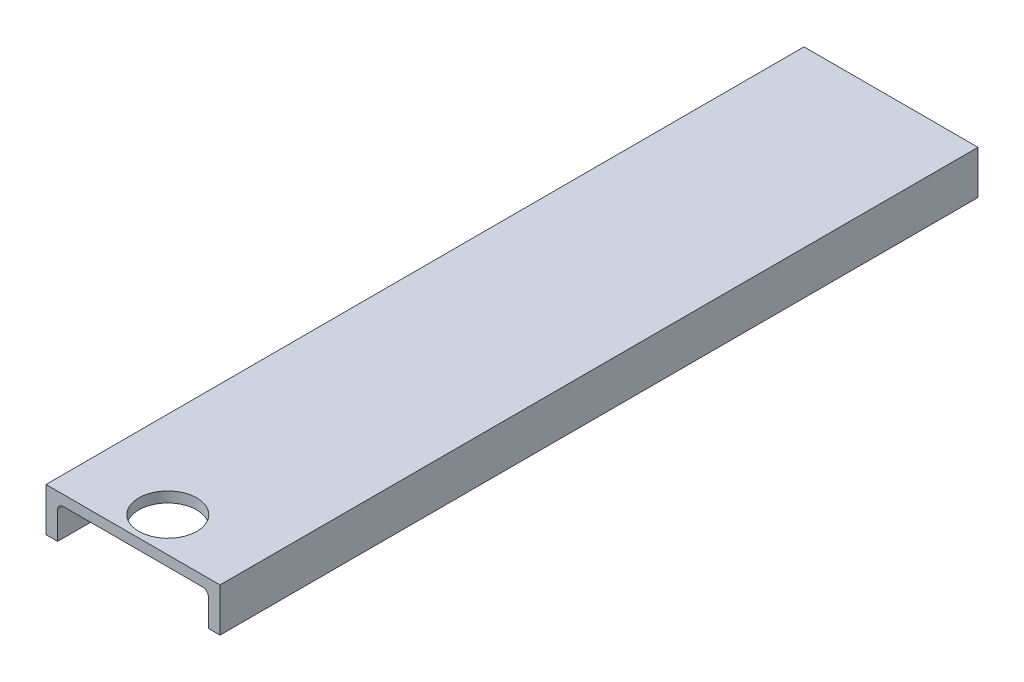
ISO-10303-21;
HEADER;
FILE_DESCRIPTION(('STEP AP214'),'2;1');
FILE_NAME('part.step','',(''),(''),'','','');
FILE_SCHEMA(('AUTOMOTIVE_DESIGN { 1 0 10303 214 1 1 1 1 }'));
ENDSEC;
DATA;
#1=APPLICATION_CONTEXT('core data for automotive mechanical design processes');
#2=APPLICATION_PROTOCOL_DEFINITION('international standard','automotive_design',2000,#1);
#3=PRODUCT_CONTEXT('',#1,'mechanical');
#4=PRODUCT('Part','Part','',(#3));
#5=PRODUCT_RELATED_PRODUCT_CATEGORY('part','',(#4));
#6=PRODUCT_DEFINITION_FORMATION('','',#4);
#7=PRODUCT_DEFINITION_CONTEXT('part definition',#1,'design');
#8=PRODUCT_DEFINITION('design','',#6,#7);
#9=PRODUCT_DEFINITION_SHAPE('','',#8);
#10=(LENGTH_UNIT() NAMED_UNIT(*) SI_UNIT(.MILLI.,.METRE.));
#11=(NAMED_UNIT(*) PLANE_ANGLE_UNIT() SI_UNIT($,.RADIAN.));
#12=(NAMED_UNIT(*) SI_UNIT($,.STERADIAN.) SOLID_ANGLE_UNIT());
#13=UNCERTAINTY_MEASURE_WITH_UNIT(LENGTH_MEASURE(1.E-05),#10,'distance_accuracy_value','');
#14=(GEOMETRIC_REPRESENTATION_CONTEXT(3) GLOBAL_UNCERTAINTY_ASSIGNED_CONTEXT((#13)) GLOBAL_UNIT_ASSIGNED_CONTEXT((#10,
#11,#12)) REPRESENTATION_CONTEXT('',''));
#15=CARTESIAN_POINT('',(0.,0.,0.));
#16=DIRECTION('',(0.,0.,1.));
#17=DIRECTION('',(1.,0.,0.));
#18=AXIS2_PLACEMENT_3D('',#15,#16,#17);
#19=CARTESIAN_POINT('',(-38.1,0.,331.978));
#20=DIRECTION('',(1.,0.,0.));
#21=DIRECTION('',(0.,0.,-1.));
#22=AXIS2_PLACEMENT_3D('',#19,#20,#21);
#23=PLANE('',#22);
#24=DIRECTION('',(0.,-1.,0.));
#25=VECTOR('',#24,1.);
#26=CARTESIAN_POINT('',(-38.1,0.,0.));
#27=LINE('',#26,#25);
#28=CARTESIAN_POINT('',(-38.1,0.,0.));
#29=VERTEX_POINT('',#28);
#30=CARTESIAN_POINT('',(-38.1,-19.05,0.));
#31=VERTEX_POINT('',#30);
#32=EDGE_CURVE('E193',#29,#31,#27,.T.);
#33=ORIENTED_EDGE('',*,*,#32,.T.);
#34=DIRECTION('',(0.,0.,-1.));
#35=VECTOR('',#34,1.);
#36=CARTESIAN_POINT('',(-38.1,-19.05,331.978));
#37=LINE('',#36,#35);
#38=CARTESIAN_POINT('',(-38.1,-19.05,331.978));
#39=VERTEX_POINT('',#38);
#40=EDGE_CURVE('E115',#39,#31,#37,.T.);
#41=ORIENTED_EDGE('',*,*,#40,.F.);
#42=DIRECTION('',(0.,-1.,0.));
#43=VECTOR('',#42,1.);
#44=CARTESIAN_POINT('',(-38.1,0.,331.978));
#45=LINE('',#44,#43);
#46=CARTESIAN_POINT('',(-38.1,0.,331.978));
#47=VERTEX_POINT('',#46);
#48=EDGE_CURVE('E110',#47,#39,#45,.T.);
#49=ORIENTED_EDGE('',*,*,#48,.F.);
#50=DIRECTION('',(0.,0.,-1.));
#51=VECTOR('',#50,1.);
#52=CARTESIAN_POINT('',(-38.1,0.,331.978));
#53=LINE('',#52,#51);
#54=EDGE_CURVE('E113',#47,#29,#53,.T.);
#55=ORIENTED_EDGE('',*,*,#54,.T.);
#56=EDGE_LOOP('',(#33,#41,#49,#55));
#57=FACE_BOUND('',#56,.T.);
#58=ADVANCED_FACE('F33',(#57),#23,.F.);
#59=CARTESIAN_POINT('',(-38.1,-19.05,331.978));
#60=DIRECTION('',(0.,1.,0.));
#61=DIRECTION('',(0.,0.,1.));
#62=AXIS2_PLACEMENT_3D('',#59,#60,#61);
#63=PLANE('',#62);
#64=DIRECTION('',(1.,0.,0.));
#65=VECTOR('',#64,1.);
#66=CARTESIAN_POINT('',(-38.1,-19.05,0.));
#67=LINE('',#66,#65);
#68=CARTESIAN_POINT('',(-33.02,-19.05,0.));
#69=VERTEX_POINT('',#68);
#70=EDGE_CURVE('E192',#31,#69,#67,.T.);
#71=ORIENTED_EDGE('',*,*,#70,.T.);
#72=DIRECTION('',(0.,0.,-1.));
#73=VECTOR('',#72,1.);
#74=CARTESIAN_POINT('',(-33.02,-19.05,331.978));
#75=LINE('',#74,#73);
#76=CARTESIAN_POINT('',(-33.02,-19.05,331.978));
#77=VERTEX_POINT('',#76);
#78=EDGE_CURVE('E138',#77,#69,#75,.T.);
#79=ORIENTED_EDGE('',*,*,#78,.F.);
#80=DIRECTION('',(1.,0.,0.));
#81=VECTOR('',#80,1.);
#82=CARTESIAN_POINT('',(-38.1,-19.05,331.978));
#83=LINE('',#82,#81);
#84=EDGE_CURVE('E118',#39,#77,#83,.T.);
#85=ORIENTED_EDGE('',*,*,#84,.F.);
#86=ORIENTED_EDGE('',*,*,#40,.T.);
#87=EDGE_LOOP('',(#71,#79,#85,#86));
#88=FACE_BOUND('',#87,.T.);
#89=ADVANCED_FACE('F228',(#88),#63,.F.);
#90=CARTESIAN_POINT('',(-33.02,-19.05,331.978));
#91=DIRECTION('',(-1.,0.,0.));
#92=DIRECTION('',(0.,0.,1.));
#93=AXIS2_PLACEMENT_3D('',#90,#91,#92);
#94=PLANE('',#93);
#95=DIRECTION('',(0.,1.,0.));
#96=VECTOR('',#95,1.);
#97=CARTESIAN_POINT('',(-33.02,-19.05,0.));
#98=LINE('',#97,#96);
#99=CARTESIAN_POINT('',(-33.02,-7.11200000000001,0.));
#100=VERTEX_POINT('',#99);
#101=EDGE_CURVE('E168',#69,#100,#98,.T.);
#102=ORIENTED_EDGE('',*,*,#101,.T.);
#103=DIRECTION('',(0.,0.,-1.));
#104=VECTOR('',#103,1.);
#105=CARTESIAN_POINT('',(-33.02,-7.11200000000001,331.978));
#106=LINE('',#105,#104);
#107=CARTESIAN_POINT('',(-33.02,-7.11200000000001,331.978));
#108=VERTEX_POINT('',#107);
#109=EDGE_CURVE('E136',#100,#108,#106,.F.);
#110=ORIENTED_EDGE('',*,*,#109,.T.);
#111=DIRECTION('',(0.,1.,0.));
#112=VECTOR('',#111,1.);
#113=CARTESIAN_POINT('',(-33.02,-19.05,331.978));
#114=LINE('',#113,#112);
#115=EDGE_CURVE('E189',#77,#108,#114,.T.);
#116=ORIENTED_EDGE('',*,*,#115,.F.);
#117=ORIENTED_EDGE('',*,*,#78,.T.);
#118=EDGE_LOOP('',(#102,#110,#116,#117));
#119=FACE_BOUND('',#118,.T.);
#120=ADVANCED_FACE('F186',(#119),#94,.F.);
#121=CARTESIAN_POINT('',(33.02,-4.572,331.978));
#122=DIRECTION('',(0.,1.,0.));
#123=DIRECTION('',(-1.,0.,0.));
#124=AXIS2_PLACEMENT_3D('',#121,#122,#123);
#125=PLANE('',#124);
#126=CARTESIAN_POINT('',(0.,-4.57200000000001,316.738));
#127=DIRECTION('',(0.,1.,0.));
#128=DIRECTION('',(-1.,0.,0.));
#129=AXIS2_PLACEMENT_3D('',#126,#127,#128);
#130=CIRCLE('',#129,12.7);
#131=CARTESIAN_POINT('',(0.,-4.57200000000001,329.438));
#132=VERTEX_POINT('',#131);
#133=EDGE_CURVE('E197',#132,#132,#130,.T.);
#134=ORIENTED_EDGE('',*,*,#133,.T.);
#135=EDGE_LOOP('',(#134));
#136=FACE_BOUND('',#135,.T.);
#137=DIRECTION('',(1.,0.,0.));
#138=VECTOR('',#137,1.);
#139=CARTESIAN_POINT('',(33.02,-4.572,0.));
#140=LINE('',#139,#138);
#141=CARTESIAN_POINT('',(-30.48,-4.57200000000001,0.));
#142=VERTEX_POINT('',#141);
#143=CARTESIAN_POINT('',(30.48,-4.572,0.));
#144=VERTEX_POINT('',#143);
#145=EDGE_CURVE('E164',#142,#144,#140,.T.);
#146=ORIENTED_EDGE('',*,*,#145,.T.);
#147=DIRECTION('',(0.,0.,-1.));
#148=VECTOR('',#147,1.);
#149=CARTESIAN_POINT('',(30.48,-4.572,331.978));
#150=LINE('',#149,#148);
#151=CARTESIAN_POINT('',(30.48,-4.572,331.978));
#152=VERTEX_POINT('',#151);
#153=EDGE_CURVE('E54',#144,#152,#150,.F.);
#154=ORIENTED_EDGE('',*,*,#153,.T.);
#155=DIRECTION('',(1.,0.,0.));
#156=VECTOR('',#155,1.);
#157=CARTESIAN_POINT('',(33.02,-4.572,331.978));
#158=LINE('',#157,#156);
#159=CARTESIAN_POINT('',(-30.48,-4.57200000000001,331.978));
#160=VERTEX_POINT('',#159);
#161=EDGE_CURVE('E202',#160,#152,#158,.T.);
#162=ORIENTED_EDGE('',*,*,#161,.F.);
#163=DIRECTION('',(0.,0.,-1.));
#164=VECTOR('',#163,1.);
#165=CARTESIAN_POINT('',(-30.48,-4.57200000000001,0.));
#166=LINE('',#165,#164);
#167=EDGE_CURVE('E133',#160,#142,#166,.T.);
#168=ORIENTED_EDGE('',*,*,#167,.T.);
#169=EDGE_LOOP('',(#146,#154,#162,#168));
#170=FACE_BOUND('',#169,.T.);
#171=ADVANCED_FACE('F244',(#136,#170),#125,.F.);
#172=CARTESIAN_POINT('',(33.02,-19.05,331.978));
#173=DIRECTION('',(1.,0.,0.));
#174=DIRECTION('',(0.,0.,-1.));
#175=AXIS2_PLACEMENT_3D('',#172,#173,#174);
#176=PLANE('',#175);
#177=DIRECTION('',(0.,-1.,0.));
#178=VECTOR('',#177,1.);
#179=CARTESIAN_POINT('',(33.02,-19.05,331.978));
#180=LINE('',#179,#178);
#181=CARTESIAN_POINT('',(33.02,-7.112,331.978));
#182=VERTEX_POINT('',#181);
#183=CARTESIAN_POINT('',(33.02,-19.05,331.978));
#184=VERTEX_POINT('',#183);
#185=EDGE_CURVE('E157',#182,#184,#180,.T.);
#186=ORIENTED_EDGE('',*,*,#185,.F.);
#187=DIRECTION('',(0.,0.,-1.));
#188=VECTOR('',#187,1.);
#189=CARTESIAN_POINT('',(33.02,-7.112,0.));
#190=LINE('',#189,#188);
#191=CARTESIAN_POINT('',(33.02,-7.112,0.));
#192=VERTEX_POINT('',#191);
#193=EDGE_CURVE('E147',#182,#192,#190,.T.);
#194=ORIENTED_EDGE('',*,*,#193,.T.);
#195=DIRECTION('',(0.,-1.,0.));
#196=VECTOR('',#195,1.);
#197=CARTESIAN_POINT('',(33.02,-19.05,0.));
#198=LINE('',#197,#196);
#199=CARTESIAN_POINT('',(33.02,-19.05,0.));
#200=VERTEX_POINT('',#199);
#201=EDGE_CURVE('E155',#192,#200,#198,.T.);
#202=ORIENTED_EDGE('',*,*,#201,.T.);
#203=DIRECTION('',(0.,0.,-1.));
#204=VECTOR('',#203,1.);
#205=CARTESIAN_POINT('',(33.02,-19.05,331.978));
#206=LINE('',#205,#204);
#207=EDGE_CURVE('E179',#184,#200,#206,.T.);
#208=ORIENTED_EDGE('',*,*,#207,.F.);
#209=EDGE_LOOP('',(#186,#194,#202,#208));
#210=FACE_BOUND('',#209,.T.);
#211=ADVANCED_FACE('F153',(#210),#176,.F.);
#212=CARTESIAN_POINT('',(38.1,-19.05,331.978));
#213=DIRECTION('',(0.,1.,0.));
#214=DIRECTION('',(0.,0.,1.));
#215=AXIS2_PLACEMENT_3D('',#212,#213,#214);
#216=PLANE('',#215);
#217=DIRECTION('',(1.,0.,0.));
#218=VECTOR('',#217,1.);
#219=CARTESIAN_POINT('',(38.1,-19.05,0.));
#220=LINE('',#219,#218);
#221=CARTESIAN_POINT('',(38.1,-19.05,0.));
#222=VERTEX_POINT('',#221);
#223=EDGE_CURVE('E163',#200,#222,#220,.T.);
#224=ORIENTED_EDGE('',*,*,#223,.T.);
#225=DIRECTION('',(0.,0.,-1.));
#226=VECTOR('',#225,1.);
#227=CARTESIAN_POINT('',(38.1,-19.05,331.978));
#228=LINE('',#227,#226);
#229=CARTESIAN_POINT('',(38.1,-19.05,331.978));
#230=VERTEX_POINT('',#229);
#231=EDGE_CURVE('E176',#230,#222,#228,.T.);
#232=ORIENTED_EDGE('',*,*,#231,.F.);
#233=DIRECTION('',(1.,0.,0.));
#234=VECTOR('',#233,1.);
#235=CARTESIAN_POINT('',(38.1,-19.05,331.978));
#236=LINE('',#235,#234);
#237=EDGE_CURVE('E199',#184,#230,#236,.T.);
#238=ORIENTED_EDGE('',*,*,#237,.F.);
#239=ORIENTED_EDGE('',*,*,#207,.T.);
#240=EDGE_LOOP('',(#224,#232,#238,#239));
#241=FACE_BOUND('',#240,.T.);
#242=ADVANCED_FACE('F223',(#241),#216,.F.);
#243=CARTESIAN_POINT('',(38.1,0.,331.978));
#244=DIRECTION('',(-1.,0.,0.));
#245=DIRECTION('',(0.,0.,1.));
#246=AXIS2_PLACEMENT_3D('',#243,#244,#245);
#247=PLANE('',#246);
#248=DIRECTION('',(0.,1.,0.));
#249=VECTOR('',#248,1.);
#250=CARTESIAN_POINT('',(38.1,0.,0.));
#251=LINE('',#250,#249);
#252=CARTESIAN_POINT('',(38.1,0.,0.));
#253=VERTEX_POINT('',#252);
#254=EDGE_CURVE('E166',#222,#253,#251,.T.);
#255=ORIENTED_EDGE('',*,*,#254,.T.);
#256=DIRECTION('',(0.,0.,-1.));
#257=VECTOR('',#256,1.);
#258=CARTESIAN_POINT('',(38.1,0.,331.978));
#259=LINE('',#258,#257);
#260=CARTESIAN_POINT('',(38.1,0.,331.978));
#261=VERTEX_POINT('',#260);
#262=EDGE_CURVE('E174',#261,#253,#259,.T.);
#263=ORIENTED_EDGE('',*,*,#262,.F.);
#264=DIRECTION('',(0.,1.,0.));
#265=VECTOR('',#264,1.);
#266=CARTESIAN_POINT('',(38.1,0.,331.978));
#267=LINE('',#266,#265);
#268=EDGE_CURVE('E124',#230,#261,#267,.T.);
#269=ORIENTED_EDGE('',*,*,#268,.F.);
#270=ORIENTED_EDGE('',*,*,#231,.T.);
#271=EDGE_LOOP('',(#255,#263,#269,#270));
#272=FACE_BOUND('',#271,.T.);
#273=ADVANCED_FACE('F216',(#272),#247,.F.);
#274=CARTESIAN_POINT('',(0.,0.,331.978));
#275=DIRECTION('',(0.,-1.,0.));
#276=DIRECTION('',(0.,0.,-1.));
#277=AXIS2_PLACEMENT_3D('',#274,#275,#276);
#278=PLANE('',#277);
#279=CARTESIAN_POINT('',(0.,0.,316.738));
#280=DIRECTION('',(0.,1.,0.));
#281=DIRECTION('',(0.,0.,1.));
#282=AXIS2_PLACEMENT_3D('',#279,#280,#281);
#283=CIRCLE('',#282,12.7);
#284=CARTESIAN_POINT('',(0.,0.,329.438));
#285=VERTEX_POINT('',#284);
#286=EDGE_CURVE('E208',#285,#285,#283,.T.);
#287=ORIENTED_EDGE('',*,*,#286,.F.);
#288=EDGE_LOOP('',(#287));
#289=FACE_BOUND('',#288,.T.);
#290=DIRECTION('',(-1.,0.,0.));
#291=VECTOR('',#290,1.);
#292=CARTESIAN_POINT('',(0.,0.,0.));
#293=LINE('',#292,#291);
#294=EDGE_CURVE('E128',#253,#29,#293,.T.);
#295=ORIENTED_EDGE('',*,*,#294,.T.);
#296=ORIENTED_EDGE('',*,*,#54,.F.);
#297=DIRECTION('',(-1.,0.,0.));
#298=VECTOR('',#297,1.);
#299=CARTESIAN_POINT('',(0.,0.,331.978));
#300=LINE('',#299,#298);
#301=EDGE_CURVE('E119',#261,#47,#300,.T.);
#302=ORIENTED_EDGE('',*,*,#301,.F.);
#303=ORIENTED_EDGE('',*,*,#262,.T.);
#304=EDGE_LOOP('',(#295,#296,#302,#303));
#305=FACE_BOUND('',#304,.T.);
#306=ADVANCED_FACE('F130',(#289,#305),#278,.F.);
#307=CARTESIAN_POINT('',(0.,0.,331.978));
#308=DIRECTION('',(0.,0.,1.));
#309=DIRECTION('',(1.,0.,0.));
#310=AXIS2_PLACEMENT_3D('',#307,#308,#309);
#311=PLANE('',#310);
#312=ORIENTED_EDGE('',*,*,#301,.T.);
#313=ORIENTED_EDGE('',*,*,#48,.T.);
#314=ORIENTED_EDGE('',*,*,#84,.T.);
#315=ORIENTED_EDGE('',*,*,#115,.T.);
#316=CARTESIAN_POINT('',(-30.48,-7.11200000000001,331.978));
#317=DIRECTION('',(0.,0.,1.));
#318=DIRECTION('',(1.,0.,0.));
#319=AXIS2_PLACEMENT_3D('',#316,#317,#318);
#320=CIRCLE('',#319,2.54);
#321=EDGE_CURVE('E145',#108,#160,#320,.F.);
#322=ORIENTED_EDGE('',*,*,#321,.T.);
#323=ORIENTED_EDGE('',*,*,#161,.T.);
#324=CARTESIAN_POINT('',(30.48,-7.112,331.978));
#325=DIRECTION('',(0.,0.,1.));
#326=DIRECTION('',(1.,0.,0.));
#327=AXIS2_PLACEMENT_3D('',#324,#325,#326);
#328=CIRCLE('',#327,2.54);
#329=EDGE_CURVE('E11',#152,#182,#328,.F.);
#330=ORIENTED_EDGE('',*,*,#329,.T.);
#331=ORIENTED_EDGE('',*,*,#185,.T.);
#332=ORIENTED_EDGE('',*,*,#237,.T.);
#333=ORIENTED_EDGE('',*,*,#268,.T.);
#334=EDGE_LOOP('',(#312,#313,#314,#315,#322,#323,#330,#331,#332,#333));
#335=FACE_BOUND('',#334,.T.);
#336=ADVANCED_FACE('F122',(#335),#311,.T.);
#337=CARTESIAN_POINT('',(0.,0.,0.));
#338=DIRECTION('',(0.,0.,1.));
#339=DIRECTION('',(1.,0.,0.));
#340=AXIS2_PLACEMENT_3D('',#337,#338,#339);
#341=PLANE('',#340);
#342=ORIENTED_EDGE('',*,*,#32,.F.);
#343=ORIENTED_EDGE('',*,*,#294,.F.);
#344=ORIENTED_EDGE('',*,*,#254,.F.);
#345=ORIENTED_EDGE('',*,*,#223,.F.);
#346=ORIENTED_EDGE('',*,*,#201,.F.);
#347=CARTESIAN_POINT('',(30.48,-7.112,0.));
#348=DIRECTION('',(0.,0.,1.));
#349=DIRECTION('',(1.,0.,0.));
#350=AXIS2_PLACEMENT_3D('',#347,#348,#349);
#351=CIRCLE('',#350,2.54);
#352=EDGE_CURVE('E41',#192,#144,#351,.T.);
#353=ORIENTED_EDGE('',*,*,#352,.T.);
#354=ORIENTED_EDGE('',*,*,#145,.F.);
#355=CARTESIAN_POINT('',(-30.48,-7.11200000000001,0.));
#356=DIRECTION('',(0.,0.,1.));
#357=DIRECTION('',(1.,0.,0.));
#358=AXIS2_PLACEMENT_3D('',#355,#356,#357);
#359=CIRCLE('',#358,2.54);
#360=EDGE_CURVE('E143',#142,#100,#359,.T.);
#361=ORIENTED_EDGE('',*,*,#360,.T.);
#362=ORIENTED_EDGE('',*,*,#101,.F.);
#363=ORIENTED_EDGE('',*,*,#70,.F.);
#364=EDGE_LOOP('',(#342,#343,#344,#345,#346,#353,#354,#361,#362,#363));
#365=FACE_BOUND('',#364,.T.);
#366=ADVANCED_FACE('F161',(#365),#341,.F.);
#367=CARTESIAN_POINT('',(-30.48,-7.11200000000001,331.978));
#368=DIRECTION('',(0.,0.,1.));
#369=DIRECTION('',(1.,0.,0.));
#370=AXIS2_PLACEMENT_3D('',#367,#368,#369);
#371=CYLINDRICAL_SURFACE('',#370,2.54);
#372=ORIENTED_EDGE('',*,*,#321,.F.);
#373=ORIENTED_EDGE('',*,*,#109,.F.);
#374=ORIENTED_EDGE('',*,*,#360,.F.);
#375=ORIENTED_EDGE('',*,*,#167,.F.);
#376=EDGE_LOOP('',(#372,#373,#374,#375));
#377=FACE_BOUND('',#376,.T.);
#378=ADVANCED_FACE('F235',(#377),#371,.F.);
#379=CARTESIAN_POINT('',(30.48,-7.112,331.978));
#380=DIRECTION('',(0.,0.,1.));
#381=DIRECTION('',(1.,0.,0.));
#382=AXIS2_PLACEMENT_3D('',#379,#380,#381);
#383=CYLINDRICAL_SURFACE('',#382,2.54);
#384=ORIENTED_EDGE('',*,*,#329,.F.);
#385=ORIENTED_EDGE('',*,*,#153,.F.);
#386=ORIENTED_EDGE('',*,*,#352,.F.);
#387=ORIENTED_EDGE('',*,*,#193,.F.);
#388=EDGE_LOOP('',(#384,#385,#386,#387));
#389=FACE_BOUND('',#388,.T.);
#390=ADVANCED_FACE('F35',(#389),#383,.F.);
#391=CARTESIAN_POINT('',(0.,-19.05,316.738));
#392=DIRECTION('',(0.,1.,0.));
#393=DIRECTION('',(0.,0.,1.));
#394=AXIS2_PLACEMENT_3D('',#391,#392,#393);
#395=CYLINDRICAL_SURFACE('',#394,12.7);
#396=CARTESIAN_POINT('',(0.,0.,329.438));
#397=CARTESIAN_POINT('',(0.,-0.0476250000000003,329.438));
#398=CARTESIAN_POINT('',(0.,-0.0952500000000004,329.438));
#399=CARTESIAN_POINT('',(0.,-0.190500000000001,329.438));
#400=CARTESIAN_POINT('',(0.,-0.238125000000001,329.438));
#401=CARTESIAN_POINT('',(0.,-0.333375000000001,329.438));
#402=CARTESIAN_POINT('',(0.,-0.381000000000002,329.438));
#403=CARTESIAN_POINT('',(0.,-0.476250000000002,329.438));
#404=CARTESIAN_POINT('',(0.,-0.523875000000002,329.438));
#405=CARTESIAN_POINT('',(0.,-0.619125000000003,329.438));
#406=CARTESIAN_POINT('',(0.,-0.666750000000003,329.438));
#407=CARTESIAN_POINT('',(0.,-0.762000000000002,329.438));
#408=CARTESIAN_POINT('',(0.,-0.809625000000001,329.438));
#409=CARTESIAN_POINT('',(0.,-0.904875000000001,329.438));
#410=CARTESIAN_POINT('',(0.,-0.952500000000001,329.438));
#411=CARTESIAN_POINT('',(0.,-1.04775,329.438));
#412=CARTESIAN_POINT('',(0.,-1.095375,329.438));
#413=CARTESIAN_POINT('',(0.,-1.190625,329.438));
#414=CARTESIAN_POINT('',(0.,-1.23825,329.438));
#415=CARTESIAN_POINT('',(0.,-1.3335,329.438));
#416=CARTESIAN_POINT('',(0.,-1.381125,329.438));
#417=CARTESIAN_POINT('',(0.,-1.476375,329.438));
#418=CARTESIAN_POINT('',(0.,-1.524,329.438));
#419=CARTESIAN_POINT('',(0.,-1.61925,329.438));
#420=CARTESIAN_POINT('',(0.,-1.666875,329.438));
#421=CARTESIAN_POINT('',(0.,-1.762125,329.438));
#422=CARTESIAN_POINT('',(0.,-1.80975,329.438));
#423=CARTESIAN_POINT('',(0.,-1.905,329.438));
#424=CARTESIAN_POINT('',(0.,-1.95262500000001,329.438));
#425=CARTESIAN_POINT('',(0.,-2.04787500000001,329.438));
#426=CARTESIAN_POINT('',(0.,-2.09550000000001,329.438));
#427=CARTESIAN_POINT('',(0.,-2.19075000000001,329.438));
#428=CARTESIAN_POINT('',(0.,-2.238375,329.438));
#429=CARTESIAN_POINT('',(0.,-2.333625,329.438));
#430=CARTESIAN_POINT('',(0.,-2.38125,329.438));
#431=CARTESIAN_POINT('',(0.,-2.4765,329.438));
#432=CARTESIAN_POINT('',(0.,-2.524125,329.438));
#433=CARTESIAN_POINT('',(0.,-2.61937500000001,329.438));
#434=CARTESIAN_POINT('',(0.,-2.667,329.438));
#435=CARTESIAN_POINT('',(0.,-2.76225000000001,329.438));
#436=CARTESIAN_POINT('',(0.,-2.80987500000001,329.438));
#437=CARTESIAN_POINT('',(0.,-2.90512500000001,329.438));
#438=CARTESIAN_POINT('',(0.,-2.95275000000001,329.438));
#439=CARTESIAN_POINT('',(0.,-3.04800000000001,329.438));
#440=CARTESIAN_POINT('',(0.,-3.09562500000001,329.438));
#441=CARTESIAN_POINT('',(0.,-3.19087500000001,329.438));
#442=CARTESIAN_POINT('',(0.,-3.23850000000001,329.438));
#443=CARTESIAN_POINT('',(0.,-3.33375000000001,329.438));
#444=CARTESIAN_POINT('',(0.,-3.38137500000001,329.438));
#445=CARTESIAN_POINT('',(0.,-3.47662500000001,329.438));
#446=CARTESIAN_POINT('',(0.,-3.52425000000001,329.438));
#447=CARTESIAN_POINT('',(0.,-3.61950000000001,329.438));
#448=CARTESIAN_POINT('',(0.,-3.66712500000001,329.438));
#449=CARTESIAN_POINT('',(0.,-3.76237500000001,329.438));
#450=CARTESIAN_POINT('',(0.,-3.81000000000001,329.438));
#451=CARTESIAN_POINT('',(0.,-3.90525000000001,329.438));
#452=CARTESIAN_POINT('',(0.,-3.95287500000001,329.438));
#453=CARTESIAN_POINT('',(0.,-4.04812500000001,329.438));
#454=CARTESIAN_POINT('',(0.,-4.09575000000001,329.438));
#455=CARTESIAN_POINT('',(0.,-4.19100000000001,329.438));
#456=CARTESIAN_POINT('',(0.,-4.23862500000001,329.438));
#457=CARTESIAN_POINT('',(0.,-4.33387500000001,329.438));
#458=CARTESIAN_POINT('',(0.,-4.38150000000001,329.438));
#459=CARTESIAN_POINT('',(0.,-4.47675000000001,329.438));
#460=CARTESIAN_POINT('',(0.,-4.52437500000001,329.438));
#461=CARTESIAN_POINT('',(0.,-4.57200000000001,329.438));
#462=B_SPLINE_CURVE_WITH_KNOTS('',3,(#396,#397,#398,#399,#400,#401,#402,#403,#404,#405,#406,
#407,#408,#409,#410,#411,#412,#413,#414,#415,#416,#417,#418,#419,#420,#421,#422,#423,#424,#425,
#426,#427,#428,#429,#430,#431,#432,#433,#434,#435,#436,#437,#438,#439,#440,#441,#442,#443,#444,
#445,#446,#447,#448,#449,#450,#451,#452,#453,#454,#455,#456,#457,#458,#459,#460,#461),
.UNSPECIFIED.,.F.,.F.,(4,2,2,2,2,2,2,2,2,2,2,2,2,2,2,2,2,2,2,2,2,2,2,2,2,2,2,2,2,2,2,2,4),(0.,
0.142875000000001,0.285750000000001,0.428625000000002,0.571500000000003,0.714375000000003,
0.85725,1.000125,1.143,1.285875,1.42875,1.571625,1.7145,1.857375,2.00025000000001,
2.14312500000001,2.286,2.428875,2.57175,2.71462500000001,2.85750000000001,3.00037500000001,
3.14325000000001,3.28612500000001,3.42900000000001,3.57187500000001,3.71475000000001,
3.85762500000001,4.00050000000001,4.14337500000001,4.28625000000001,4.42912500000001,
4.57200000000001),.UNSPECIFIED.);
#463=EDGE_CURVE('BSEAM212',#285,#132,#462,.T.);
#464=ORIENTED_EDGE('',*,*,#286,.T.);
#465=ORIENTED_EDGE('',*,*,#133,.F.);
#466=ORIENTED_EDGE('',*,*,#463,.T.);
#467=ORIENTED_EDGE('',*,*,#463,.F.);
#468=EDGE_LOOP('',(#464,#466,#465,#467));
#469=FACE_BOUND('',#468,.T.);
#470=ADVANCED_FACE('F212',(#469),#395,.F.);
#471=CLOSED_SHELL('',(#58,#89,#120,#171,#211,#242,#273,#306,#336,#366,#378,#390,#470));
#472=MANIFOLD_SOLID_BREP('B2',#471);
#473=ADVANCED_BREP_SHAPE_REPRESENTATION('',(#18,#472),#14);
#474=SHAPE_DEFINITION_REPRESENTATION(#9,#473);
ENDSEC;
END-ISO-10303-21;
